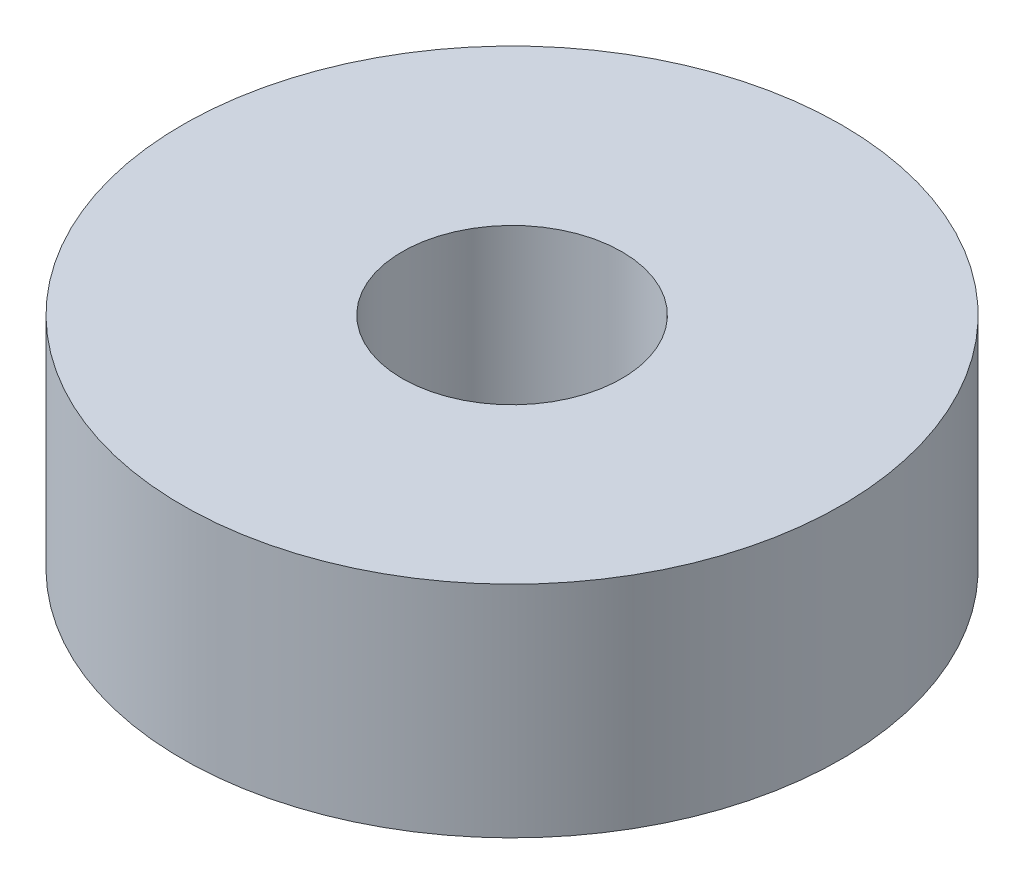
ISO-10303-21;
HEADER;
FILE_DESCRIPTION(('STEP AP214'),'2;1');
FILE_NAME('part.step','',(''),(''),'','','');
FILE_SCHEMA(('AUTOMOTIVE_DESIGN { 1 0 10303 214 1 1 1 1 }'));
ENDSEC;
DATA;
#1=APPLICATION_CONTEXT('core data for automotive mechanical design processes');
#2=APPLICATION_PROTOCOL_DEFINITION('international standard','automotive_design',2000,#1);
#3=PRODUCT_CONTEXT('',#1,'mechanical');
#4=PRODUCT('Part','Part','',(#3));
#5=PRODUCT_RELATED_PRODUCT_CATEGORY('part','',(#4));
#6=PRODUCT_DEFINITION_FORMATION('','',#4);
#7=PRODUCT_DEFINITION_CONTEXT('part definition',#1,'design');
#8=PRODUCT_DEFINITION('design','',#6,#7);
#9=PRODUCT_DEFINITION_SHAPE('','',#8);
#10=(LENGTH_UNIT() NAMED_UNIT(*) SI_UNIT(.MILLI.,.METRE.));
#11=(NAMED_UNIT(*) PLANE_ANGLE_UNIT() SI_UNIT($,.RADIAN.));
#12=(NAMED_UNIT(*) SI_UNIT($,.STERADIAN.) SOLID_ANGLE_UNIT());
#13=UNCERTAINTY_MEASURE_WITH_UNIT(LENGTH_MEASURE(1.E-05),#10,'distance_accuracy_value','');
#14=(GEOMETRIC_REPRESENTATION_CONTEXT(3) GLOBAL_UNCERTAINTY_ASSIGNED_CONTEXT((#13)) GLOBAL_UNIT_ASSIGNED_CONTEXT((#10,
#11,#12)) REPRESENTATION_CONTEXT('',''));
#15=CARTESIAN_POINT('',(0.,0.,0.));
#16=DIRECTION('',(0.,0.,1.));
#17=DIRECTION('',(1.,0.,0.));
#18=AXIS2_PLACEMENT_3D('',#15,#16,#17);
#19=CARTESIAN_POINT('',(0.,0.,0.));
#20=DIRECTION('',(0.,-1.,0.));
#21=DIRECTION('',(0.,0.,-1.));
#22=AXIS2_PLACEMENT_3D('',#19,#20,#21);
#23=CYLINDRICAL_SURFACE('',#22,5.);
#24=CARTESIAN_POINT('',(0.,0.,0.));
#25=DIRECTION('',(0.,-1.,0.));
#26=DIRECTION('',(0.,0.,-1.));
#27=AXIS2_PLACEMENT_3D('',#24,#25,#26);
#28=CIRCLE('',#27,5.);
#29=CARTESIAN_POINT('',(0.,0.,-5.));
#30=VERTEX_POINT('',#29);
#31=EDGE_CURVE('E55',#30,#30,#28,.T.);
#32=ORIENTED_EDGE('',*,*,#31,.T.);
#33=EDGE_LOOP('',(#32));
#34=FACE_BOUND('',#33,.T.);
#35=CARTESIAN_POINT('',(0.,10.,0.));
#36=DIRECTION('',(0.,-1.,0.));
#37=DIRECTION('',(0.,0.,-1.));
#38=AXIS2_PLACEMENT_3D('',#35,#36,#37);
#39=CIRCLE('',#38,5.);
#40=CARTESIAN_POINT('',(0.,10.,-5.));
#41=VERTEX_POINT('',#40);
#42=EDGE_CURVE('E10',#41,#41,#39,.T.);
#43=ORIENTED_EDGE('',*,*,#42,.F.);
#44=EDGE_LOOP('',(#43));
#45=FACE_BOUND('',#44,.T.);
#46=ADVANCED_FACE('F36',(#34,#45),#23,.F.);
#47=CARTESIAN_POINT('',(5.,10.,0.));
#48=DIRECTION('',(0.,1.,0.));
#49=DIRECTION('',(0.,0.,1.));
#50=AXIS2_PLACEMENT_3D('',#47,#48,#49);
#51=PLANE('',#50);
#52=ORIENTED_EDGE('',*,*,#42,.T.);
#53=EDGE_LOOP('',(#52));
#54=FACE_BOUND('',#53,.T.);
#55=CARTESIAN_POINT('',(0.,10.,0.));
#56=DIRECTION('',(0.,-1.,0.));
#57=DIRECTION('',(0.,0.,-1.));
#58=AXIS2_PLACEMENT_3D('',#55,#56,#57);
#59=CIRCLE('',#58,15.);
#60=CARTESIAN_POINT('',(0.,10.,-15.));
#61=VERTEX_POINT('',#60);
#62=EDGE_CURVE('E42',#61,#61,#59,.T.);
#63=ORIENTED_EDGE('',*,*,#62,.F.);
#64=EDGE_LOOP('',(#63));
#65=FACE_BOUND('',#64,.T.);
#66=ADVANCED_FACE('F68',(#54,#65),#51,.T.);
#67=CARTESIAN_POINT('',(0.,0.,0.));
#68=DIRECTION('',(0.,-1.,0.));
#69=DIRECTION('',(0.,0.,-1.));
#70=AXIS2_PLACEMENT_3D('',#67,#68,#69);
#71=CYLINDRICAL_SURFACE('',#70,15.);
#72=ORIENTED_EDGE('',*,*,#62,.T.);
#73=EDGE_LOOP('',(#72));
#74=FACE_BOUND('',#73,.T.);
#75=CARTESIAN_POINT('',(0.,0.,0.));
#76=DIRECTION('',(0.,-1.,0.));
#77=DIRECTION('',(0.,0.,-1.));
#78=AXIS2_PLACEMENT_3D('',#75,#76,#77);
#79=CIRCLE('',#78,15.);
#80=CARTESIAN_POINT('',(0.,0.,-15.));
#81=VERTEX_POINT('',#80);
#82=EDGE_CURVE('E48',#81,#81,#79,.T.);
#83=ORIENTED_EDGE('',*,*,#82,.F.);
#84=EDGE_LOOP('',(#83));
#85=FACE_BOUND('',#84,.T.);
#86=ADVANCED_FACE('F64',(#74,#85),#71,.T.);
#87=CARTESIAN_POINT('',(5.,0.,0.));
#88=DIRECTION('',(0.,-1.,0.));
#89=DIRECTION('',(0.,0.,-1.));
#90=AXIS2_PLACEMENT_3D('',#87,#88,#89);
#91=PLANE('',#90);
#92=ORIENTED_EDGE('',*,*,#82,.T.);
#93=EDGE_LOOP('',(#92));
#94=FACE_BOUND('',#93,.T.);
#95=ORIENTED_EDGE('',*,*,#31,.F.);
#96=EDGE_LOOP('',(#95));
#97=FACE_BOUND('',#96,.T.);
#98=ADVANCED_FACE('F58',(#94,#97),#91,.T.);
#99=CLOSED_SHELL('',(#46,#66,#86,#98));
#100=MANIFOLD_SOLID_BREP('B2',#99);
#101=ADVANCED_BREP_SHAPE_REPRESENTATION('',(#18,#100),#14);
#102=SHAPE_DEFINITION_REPRESENTATION(#9,#101);
ENDSEC;
END-ISO-10303-21;
